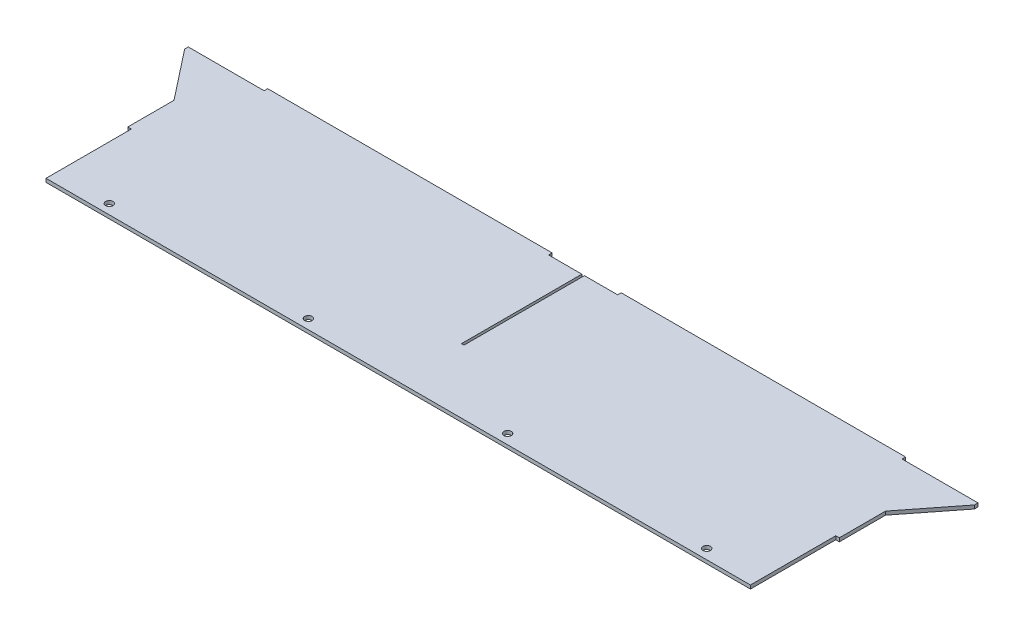
ISO-10303-21;
HEADER;
FILE_DESCRIPTION(('STEP AP214'),'2;1');
FILE_NAME('part.step','',(''),(''),'','','');
FILE_SCHEMA(('AUTOMOTIVE_DESIGN { 1 0 10303 214 1 1 1 1 }'));
ENDSEC;
DATA;
#1=APPLICATION_CONTEXT('core data for automotive mechanical design processes');
#2=APPLICATION_PROTOCOL_DEFINITION('international standard','automotive_design',2000,#1);
#3=PRODUCT_CONTEXT('',#1,'mechanical');
#4=PRODUCT('Part','Part','',(#3));
#5=PRODUCT_RELATED_PRODUCT_CATEGORY('part','',(#4));
#6=PRODUCT_DEFINITION_FORMATION('','',#4);
#7=PRODUCT_DEFINITION_CONTEXT('part definition',#1,'design');
#8=PRODUCT_DEFINITION('design','',#6,#7);
#9=PRODUCT_DEFINITION_SHAPE('','',#8);
#10=(LENGTH_UNIT() NAMED_UNIT(*) SI_UNIT(.MILLI.,.METRE.));
#11=(NAMED_UNIT(*) PLANE_ANGLE_UNIT() SI_UNIT($,.RADIAN.));
#12=(NAMED_UNIT(*) SI_UNIT($,.STERADIAN.) SOLID_ANGLE_UNIT());
#13=UNCERTAINTY_MEASURE_WITH_UNIT(LENGTH_MEASURE(1.E-05),#10,'distance_accuracy_value','');
#14=(GEOMETRIC_REPRESENTATION_CONTEXT(3) GLOBAL_UNCERTAINTY_ASSIGNED_CONTEXT((#13)) GLOBAL_UNIT_ASSIGNED_CONTEXT((#10,
#11,#12)) REPRESENTATION_CONTEXT('',''));
#15=CARTESIAN_POINT('',(0.,0.,0.));
#16=DIRECTION('',(0.,0.,1.));
#17=DIRECTION('',(1.,0.,0.));
#18=AXIS2_PLACEMENT_3D('',#15,#16,#17);
#19=CARTESIAN_POINT('',(-266.7,1.5875,73.8124000000001));
#20=DIRECTION('',(0.,1.,0.));
#21=DIRECTION('',(0.,0.,1.));
#22=AXIS2_PLACEMENT_3D('',#19,#20,#21);
#23=CYLINDRICAL_SURFACE('',#22,3.3);
#24=CARTESIAN_POINT('',(-266.7,-1.58750000000007,73.8124000000001));
#25=DIRECTION('',(0.,1.,0.));
#26=DIRECTION('',(0.,0.,1.));
#27=AXIS2_PLACEMENT_3D('',#24,#25,#26);
#28=CIRCLE('',#27,3.30000000000003);
#29=CARTESIAN_POINT('',(-266.7,-1.58750000000007,77.1124000000001));
#30=VERTEX_POINT('',#29);
#31=EDGE_CURVE('E47',#30,#30,#28,.T.);
#32=ORIENTED_EDGE('',*,*,#31,.F.);
#33=EDGE_LOOP('',(#32));
#34=FACE_BOUND('',#33,.T.);
#35=CARTESIAN_POINT('',(-266.7,1.5875,73.8124000000001));
#36=DIRECTION('',(0.,1.,0.));
#37=DIRECTION('',(0.,0.,1.));
#38=AXIS2_PLACEMENT_3D('',#35,#36,#37);
#39=CIRCLE('',#38,3.29999999999997);
#40=CARTESIAN_POINT('',(-266.7,1.5875,77.1124000000001));
#41=VERTEX_POINT('',#40);
#42=EDGE_CURVE('E11',#41,#41,#39,.T.);
#43=ORIENTED_EDGE('',*,*,#42,.T.);
#44=EDGE_LOOP('',(#43));
#45=FACE_BOUND('',#44,.T.);
#46=ADVANCED_FACE('F39',(#34,#45),#23,.F.);
#47=CARTESIAN_POINT('',(-88.8999999999999,1.5875,73.8124000000001));
#48=DIRECTION('',(0.,1.,0.));
#49=DIRECTION('',(0.,0.,1.));
#50=AXIS2_PLACEMENT_3D('',#47,#48,#49);
#51=CYLINDRICAL_SURFACE('',#50,3.3);
#52=CARTESIAN_POINT('',(-88.8999999999999,-1.58750000000007,73.8124000000001));
#53=DIRECTION('',(0.,1.,0.));
#54=DIRECTION('',(0.,0.,1.));
#55=AXIS2_PLACEMENT_3D('',#52,#53,#54);
#56=CIRCLE('',#55,3.30000000000003);
#57=CARTESIAN_POINT('',(-88.8999999999999,-1.58750000000007,77.1124000000001));
#58=VERTEX_POINT('',#57);
#59=EDGE_CURVE('E230',#58,#58,#56,.T.);
#60=ORIENTED_EDGE('',*,*,#59,.F.);
#61=EDGE_LOOP('',(#60));
#62=FACE_BOUND('',#61,.T.);
#63=CARTESIAN_POINT('',(-88.8999999999999,1.5875,73.8124000000001));
#64=DIRECTION('',(0.,1.,0.));
#65=DIRECTION('',(0.,0.,1.));
#66=AXIS2_PLACEMENT_3D('',#63,#64,#65);
#67=CIRCLE('',#66,3.29999999999997);
#68=CARTESIAN_POINT('',(-88.8999999999999,1.5875,77.1124000000001));
#69=VERTEX_POINT('',#68);
#70=EDGE_CURVE('E236',#69,#69,#67,.T.);
#71=ORIENTED_EDGE('',*,*,#70,.T.);
#72=EDGE_LOOP('',(#71));
#73=FACE_BOUND('',#72,.T.);
#74=ADVANCED_FACE('F270',(#62,#73),#51,.F.);
#75=CARTESIAN_POINT('',(317.6778,1.5875,-82.55));
#76=DIRECTION('',(-1.,0.,0.));
#77=DIRECTION('',(0.,0.,1.));
#78=AXIS2_PLACEMENT_3D('',#75,#76,#77);
#79=PLANE('',#78);
#80=DIRECTION('',(0.,-1.,0.));
#81=VECTOR('',#80,1.);
#82=CARTESIAN_POINT('',(317.6778,1.5875,6.35000000000007));
#83=LINE('',#82,#81);
#84=CARTESIAN_POINT('',(317.6778,1.5875,6.35000000000007));
#85=VERTEX_POINT('',#84);
#86=CARTESIAN_POINT('',(317.6778,-1.5875,6.35000000000007));
#87=VERTEX_POINT('',#86);
#88=EDGE_CURVE('E762',#85,#87,#83,.T.);
#89=ORIENTED_EDGE('',*,*,#88,.T.);
#90=DIRECTION('',(0.,0.,-1.));
#91=VECTOR('',#90,1.);
#92=CARTESIAN_POINT('',(317.6778,-1.5875,-82.55));
#93=LINE('',#92,#91);
#94=CARTESIAN_POINT('',(317.6778,-1.5875,-34.925));
#95=VERTEX_POINT('',#94);
#96=EDGE_CURVE('E242',#87,#95,#93,.T.);
#97=ORIENTED_EDGE('',*,*,#96,.T.);
#98=DIRECTION('',(0.,-1.,0.));
#99=VECTOR('',#98,1.);
#100=CARTESIAN_POINT('',(317.6778,1.5875,-34.925));
#101=LINE('',#100,#99);
#102=CARTESIAN_POINT('',(317.6778,1.5875,-34.925));
#103=VERTEX_POINT('',#102);
#104=EDGE_CURVE('E622',#103,#95,#101,.T.);
#105=ORIENTED_EDGE('',*,*,#104,.F.);
#106=DIRECTION('',(0.,0.,-1.));
#107=VECTOR('',#106,1.);
#108=CARTESIAN_POINT('',(317.6778,1.5875,-82.55));
#109=LINE('',#108,#107);
#110=EDGE_CURVE('E258',#85,#103,#109,.T.);
#111=ORIENTED_EDGE('',*,*,#110,.F.);
#112=EDGE_LOOP('',(#89,#97,#105,#111));
#113=FACE_BOUND('',#112,.T.);
#114=ADVANCED_FACE('F301',(#113),#79,.F.);
#115=CARTESIAN_POINT('',(-317.6778,1.5875,-82.55));
#116=DIRECTION('',(0.,0.,1.));
#117=DIRECTION('',(1.,0.,0.));
#118=AXIS2_PLACEMENT_3D('',#115,#116,#117);
#119=PLANE('',#118);
#120=DIRECTION('',(0.,-1.,0.));
#121=VECTOR('',#120,1.);
#122=CARTESIAN_POINT('',(-1.14299999999998,1.5875,-82.55));
#123=LINE('',#122,#121);
#124=CARTESIAN_POINT('',(-1.14299999999998,1.5875,-82.55));
#125=VERTEX_POINT('',#124);
#126=CARTESIAN_POINT('',(-1.14299999999998,-1.5875,-82.55));
#127=VERTEX_POINT('',#126);
#128=EDGE_CURVE('E549',#125,#127,#123,.T.);
#129=ORIENTED_EDGE('',*,*,#128,.T.);
#130=DIRECTION('',(-1.,0.,0.));
#131=VECTOR('',#130,1.);
#132=CARTESIAN_POINT('',(-317.6778,-1.5875,-82.55));
#133=LINE('',#132,#131);
#134=CARTESIAN_POINT('',(-30.8229000000015,-1.5875,-82.55));
#135=VERTEX_POINT('',#134);
#136=EDGE_CURVE('E252',#127,#135,#133,.T.);
#137=ORIENTED_EDGE('',*,*,#136,.T.);
#138=DIRECTION('',(0.,-1.,0.));
#139=VECTOR('',#138,1.);
#140=CARTESIAN_POINT('',(-30.8229000000015,-1.58750000000007,-82.55));
#141=LINE('',#140,#139);
#142=CARTESIAN_POINT('',(-30.8229000000015,1.5875,-82.55));
#143=VERTEX_POINT('',#142);
#144=EDGE_CURVE('E669',#143,#135,#141,.T.);
#145=ORIENTED_EDGE('',*,*,#144,.F.);
#146=DIRECTION('',(-1.,0.,0.));
#147=VECTOR('',#146,1.);
#148=CARTESIAN_POINT('',(-317.6778,1.5875,-82.55));
#149=LINE('',#148,#147);
#150=EDGE_CURVE('E553',#125,#143,#149,.T.);
#151=ORIENTED_EDGE('',*,*,#150,.F.);
#152=EDGE_LOOP('',(#129,#137,#145,#151));
#153=FACE_BOUND('',#152,.T.);
#154=ADVANCED_FACE('F284',(#153),#119,.F.);
#155=CARTESIAN_POINT('',(-317.6778,1.5875,82.55));
#156=DIRECTION('',(0.,0.,-1.));
#157=DIRECTION('',(-1.,0.,0.));
#158=AXIS2_PLACEMENT_3D('',#155,#156,#157);
#159=PLANE('',#158);
#160=DIRECTION('',(1.,0.,0.));
#161=VECTOR('',#160,1.);
#162=CARTESIAN_POINT('',(-317.6778,-1.5875,82.55));
#163=LINE('',#162,#161);
#164=CARTESIAN_POINT('',(-314.5028,-1.5875,82.55));
#165=VERTEX_POINT('',#164);
#166=CARTESIAN_POINT('',(314.5028,-1.5875,82.55));
#167=VERTEX_POINT('',#166);
#168=EDGE_CURVE('E256',#165,#167,#163,.T.);
#169=ORIENTED_EDGE('',*,*,#168,.T.);
#170=DIRECTION('',(0.,-1.,0.));
#171=VECTOR('',#170,1.);
#172=CARTESIAN_POINT('',(314.5028,1.5875,82.55));
#173=LINE('',#172,#171);
#174=CARTESIAN_POINT('',(314.5028,1.5875,82.55));
#175=VERTEX_POINT('',#174);
#176=EDGE_CURVE('E228',#175,#167,#173,.T.);
#177=ORIENTED_EDGE('',*,*,#176,.F.);
#178=DIRECTION('',(1.,0.,0.));
#179=VECTOR('',#178,1.);
#180=CARTESIAN_POINT('',(-317.6778,1.5875,82.55));
#181=LINE('',#180,#179);
#182=CARTESIAN_POINT('',(-314.5028,1.5875,82.55));
#183=VERTEX_POINT('',#182);
#184=EDGE_CURVE('E221',#183,#175,#181,.T.);
#185=ORIENTED_EDGE('',*,*,#184,.F.);
#186=DIRECTION('',(0.,-1.,0.));
#187=VECTOR('',#186,1.);
#188=CARTESIAN_POINT('',(-314.5028,1.5875,82.55));
#189=LINE('',#188,#187);
#190=EDGE_CURVE('E201',#183,#165,#189,.T.);
#191=ORIENTED_EDGE('',*,*,#190,.T.);
#192=EDGE_LOOP('',(#169,#177,#185,#191));
#193=FACE_BOUND('',#192,.T.);
#194=ADVANCED_FACE('F227',(#193),#159,.F.);
#195=CARTESIAN_POINT('',(0.,1.5875,0.));
#196=DIRECTION('',(0.,1.,0.));
#197=DIRECTION('',(0.,0.,1.));
#198=AXIS2_PLACEMENT_3D('',#195,#196,#197);
#199=PLANE('',#198);
#200=CARTESIAN_POINT('',(88.9000000000001,1.5875,73.8124000000001));
#201=DIRECTION('',(0.,1.,0.));
#202=DIRECTION('',(0.,0.,1.));
#203=AXIS2_PLACEMENT_3D('',#200,#201,#202);
#204=CIRCLE('',#203,3.29999999999997);
#205=CARTESIAN_POINT('',(88.9000000000001,1.5875,77.1124000000001));
#206=VERTEX_POINT('',#205);
#207=EDGE_CURVE('E804',#206,#206,#204,.T.);
#208=ORIENTED_EDGE('',*,*,#207,.F.);
#209=EDGE_LOOP('',(#208));
#210=FACE_BOUND('',#209,.T.);
#211=CARTESIAN_POINT('',(266.7,1.5875,73.8124000000001));
#212=DIRECTION('',(0.,1.,0.));
#213=DIRECTION('',(0.,0.,1.));
#214=AXIS2_PLACEMENT_3D('',#211,#212,#213);
#215=CIRCLE('',#214,3.29999999999997);
#216=CARTESIAN_POINT('',(266.7,1.5875,77.1124000000001));
#217=VERTEX_POINT('',#216);
#218=EDGE_CURVE('E800',#217,#217,#215,.T.);
#219=ORIENTED_EDGE('',*,*,#218,.F.);
#220=EDGE_LOOP('',(#219));
#221=FACE_BOUND('',#220,.T.);
#222=DIRECTION('',(0.,0.,-1.));
#223=VECTOR('',#222,1.);
#224=CARTESIAN_POINT('',(314.5028,1.5875,0.));
#225=LINE('',#224,#223);
#226=CARTESIAN_POINT('',(314.5028,1.5875,6.35000000000006));
#227=VERTEX_POINT('',#226);
#228=EDGE_CURVE('E768',#175,#227,#225,.T.);
#229=ORIENTED_EDGE('',*,*,#228,.T.);
#230=DIRECTION('',(-1.,0.,0.));
#231=VECTOR('',#230,1.);
#232=CARTESIAN_POINT('',(0.,1.5875,6.34999999999998));
#233=LINE('',#232,#231);
#234=EDGE_CURVE('E772',#85,#227,#233,.T.);
#235=ORIENTED_EDGE('',*,*,#234,.F.);
#236=ORIENTED_EDGE('',*,*,#110,.T.);
#237=DIRECTION('',(-0.617821551931904,0.,0.786318338822422));
#238=VECTOR('',#237,1.);
#239=CARTESIAN_POINT('',(352.6028,1.5875,-79.375));
#240=LINE('',#239,#238);
#241=CARTESIAN_POINT('',(352.6028,1.5875,-79.375));
#242=VERTEX_POINT('',#241);
#243=EDGE_CURVE('E610',#242,#103,#240,.T.);
#244=ORIENTED_EDGE('',*,*,#243,.F.);
#245=DIRECTION('',(0.,0.,1.));
#246=VECTOR('',#245,1.);
#247=CARTESIAN_POINT('',(352.6028,1.5875,-82.55));
#248=LINE('',#247,#246);
#249=CARTESIAN_POINT('',(352.6028,1.5875,-82.55));
#250=VERTEX_POINT('',#249);
#251=EDGE_CURVE('E606',#250,#242,#248,.T.);
#252=ORIENTED_EDGE('',*,*,#251,.F.);
#253=CARTESIAN_POINT('',(284.822900000001,1.5875,-82.55));
#254=VERTEX_POINT('',#253);
#255=EDGE_CURVE('E238',#250,#254,#149,.T.);
#256=ORIENTED_EDGE('',*,*,#255,.T.);
#257=DIRECTION('',(0.,0.,1.));
#258=VECTOR('',#257,1.);
#259=CARTESIAN_POINT('',(284.822900000001,1.58749999999994,-85.725));
#260=LINE('',#259,#258);
#261=CARTESIAN_POINT('',(284.822900000001,1.58749999999994,-85.725));
#262=VERTEX_POINT('',#261);
#263=EDGE_CURVE('E647',#262,#254,#260,.T.);
#264=ORIENTED_EDGE('',*,*,#263,.F.);
#265=DIRECTION('',(1.,0.,0.));
#266=VECTOR('',#265,1.);
#267=CARTESIAN_POINT('',(284.822900000001,1.58749999999994,-85.725));
#268=LINE('',#267,#266);
#269=CARTESIAN_POINT('',(30.8229000000015,1.58749999999994,-85.725));
#270=VERTEX_POINT('',#269);
#271=EDGE_CURVE('E644',#270,#262,#268,.T.);
#272=ORIENTED_EDGE('',*,*,#271,.F.);
#273=DIRECTION('',(0.,0.,1.));
#274=VECTOR('',#273,1.);
#275=CARTESIAN_POINT('',(30.8229000000015,1.58749999999994,-85.725));
#276=LINE('',#275,#274);
#277=CARTESIAN_POINT('',(30.8229000000014,1.5875,-82.55));
#278=VERTEX_POINT('',#277);
#279=EDGE_CURVE('E657',#270,#278,#276,.T.);
#280=ORIENTED_EDGE('',*,*,#279,.T.);
#281=CARTESIAN_POINT('',(1.14300000000002,1.5875,-82.55));
#282=VERTEX_POINT('',#281);
#283=EDGE_CURVE('E704',#278,#282,#149,.T.);
#284=ORIENTED_EDGE('',*,*,#283,.T.);
#285=DIRECTION('',(0.,0.,1.));
#286=VECTOR('',#285,1.);
#287=CARTESIAN_POINT('',(1.14300000000002,1.5875,0.));
#288=LINE('',#287,#286);
#289=CARTESIAN_POINT('',(1.14300000000002,1.5875,24.892));
#290=VERTEX_POINT('',#289);
#291=EDGE_CURVE('E721',#282,#290,#288,.T.);
#292=ORIENTED_EDGE('',*,*,#291,.T.);
#293=DIRECTION('',(1.,0.,0.));
#294=VECTOR('',#293,1.);
#295=CARTESIAN_POINT('',(0.,1.5875,24.892));
#296=LINE('',#295,#294);
#297=CARTESIAN_POINT('',(-1.14299999999998,1.5875,24.892));
#298=VERTEX_POINT('',#297);
#299=EDGE_CURVE('E719',#298,#290,#296,.T.);
#300=ORIENTED_EDGE('',*,*,#299,.F.);
#301=DIRECTION('',(0.,0.,1.));
#302=VECTOR('',#301,1.);
#303=CARTESIAN_POINT('',(-1.14299999999998,1.5875,0.));
#304=LINE('',#303,#302);
#305=EDGE_CURVE('E717',#125,#298,#304,.T.);
#306=ORIENTED_EDGE('',*,*,#305,.F.);
#307=ORIENTED_EDGE('',*,*,#150,.T.);
#308=DIRECTION('',(0.,0.,1.));
#309=VECTOR('',#308,1.);
#310=CARTESIAN_POINT('',(-30.8229000000015,1.58749999999994,-85.725));
#311=LINE('',#310,#309);
#312=CARTESIAN_POINT('',(-30.8229000000015,1.58749999999994,-85.725));
#313=VERTEX_POINT('',#312);
#314=EDGE_CURVE('E683',#313,#143,#311,.T.);
#315=ORIENTED_EDGE('',*,*,#314,.F.);
#316=DIRECTION('',(1.,0.,0.));
#317=VECTOR('',#316,1.);
#318=CARTESIAN_POINT('',(-30.8229000000015,1.58749999999994,-85.725));
#319=LINE('',#318,#317);
#320=CARTESIAN_POINT('',(-284.822900000001,1.58749999999994,-85.725));
#321=VERTEX_POINT('',#320);
#322=EDGE_CURVE('E680',#321,#313,#319,.T.);
#323=ORIENTED_EDGE('',*,*,#322,.F.);
#324=DIRECTION('',(0.,0.,1.));
#325=VECTOR('',#324,1.);
#326=CARTESIAN_POINT('',(-284.822900000001,1.58749999999994,-85.725));
#327=LINE('',#326,#325);
#328=CARTESIAN_POINT('',(-284.822900000001,1.58749999999994,-82.55));
#329=VERTEX_POINT('',#328);
#330=EDGE_CURVE('E691',#321,#329,#327,.T.);
#331=ORIENTED_EDGE('',*,*,#330,.T.);
#332=CARTESIAN_POINT('',(-352.6028,1.5875,-82.55));
#333=VERTEX_POINT('',#332);
#334=EDGE_CURVE('E701',#329,#333,#149,.T.);
#335=ORIENTED_EDGE('',*,*,#334,.T.);
#336=DIRECTION('',(0.,0.,1.));
#337=VECTOR('',#336,1.);
#338=CARTESIAN_POINT('',(-352.6028,1.5875,-82.55));
#339=LINE('',#338,#337);
#340=CARTESIAN_POINT('',(-352.6028,1.5875,-79.375));
#341=VERTEX_POINT('',#340);
#342=EDGE_CURVE('E582',#333,#341,#339,.T.);
#343=ORIENTED_EDGE('',*,*,#342,.T.);
#344=DIRECTION('',(0.617821551931904,0.,0.786318338822422));
#345=VECTOR('',#344,1.);
#346=CARTESIAN_POINT('',(-352.6028,1.5875,-79.375));
#347=LINE('',#346,#345);
#348=CARTESIAN_POINT('',(-317.6778,1.5875,-34.925));
#349=VERTEX_POINT('',#348);
#350=EDGE_CURVE('E591',#341,#349,#347,.T.);
#351=ORIENTED_EDGE('',*,*,#350,.T.);
#352=DIRECTION('',(0.,0.,1.));
#353=VECTOR('',#352,1.);
#354=CARTESIAN_POINT('',(-317.6778,1.5875,-82.55));
#355=LINE('',#354,#353);
#356=CARTESIAN_POINT('',(-317.6778,1.5875,6.34999999999999));
#357=VERTEX_POINT('',#356);
#358=EDGE_CURVE('E231',#349,#357,#355,.T.);
#359=ORIENTED_EDGE('',*,*,#358,.T.);
#360=DIRECTION('',(1.,0.,0.));
#361=VECTOR('',#360,1.);
#362=CARTESIAN_POINT('',(0.,1.5875,6.34999999999999));
#363=LINE('',#362,#361);
#364=CARTESIAN_POINT('',(-314.5028,1.5875,6.34999999999999));
#365=VERTEX_POINT('',#364);
#366=EDGE_CURVE('E213',#357,#365,#363,.T.);
#367=ORIENTED_EDGE('',*,*,#366,.T.);
#368=DIRECTION('',(0.,0.,-1.));
#369=VECTOR('',#368,1.);
#370=CARTESIAN_POINT('',(-314.5028,1.5875,0.));
#371=LINE('',#370,#369);
#372=EDGE_CURVE('E204',#183,#365,#371,.T.);
#373=ORIENTED_EDGE('',*,*,#372,.F.);
#374=ORIENTED_EDGE('',*,*,#184,.T.);
#375=EDGE_LOOP('',(#229,#235,#236,#244,#252,#256,#264,#272,#280,#284,#292,#300,#306,#307,#315,
#323,#331,#335,#343,#351,#359,#367,#373,#374));
#376=FACE_BOUND('',#375,.T.);
#377=ORIENTED_EDGE('',*,*,#70,.F.);
#378=EDGE_LOOP('',(#377));
#379=FACE_BOUND('',#378,.T.);
#380=ORIENTED_EDGE('',*,*,#42,.F.);
#381=EDGE_LOOP('',(#380));
#382=FACE_BOUND('',#381,.T.);
#383=ADVANCED_FACE('F219',(#210,#221,#376,#379,#382),#199,.T.);
#384=CARTESIAN_POINT('',(0.,-1.5875,0.));
#385=DIRECTION('',(0.,1.,0.));
#386=DIRECTION('',(0.,0.,1.));
#387=AXIS2_PLACEMENT_3D('',#384,#385,#386);
#388=PLANE('',#387);
#389=CARTESIAN_POINT('',(88.9000000000001,-1.58750000000007,73.8124000000001));
#390=DIRECTION('',(0.,1.,0.));
#391=DIRECTION('',(0.,0.,1.));
#392=AXIS2_PLACEMENT_3D('',#389,#390,#391);
#393=CIRCLE('',#392,3.30000000000003);
#394=CARTESIAN_POINT('',(88.9000000000001,-1.58750000000007,77.1124000000001));
#395=VERTEX_POINT('',#394);
#396=EDGE_CURVE('E808',#395,#395,#393,.T.);
#397=ORIENTED_EDGE('',*,*,#396,.T.);
#398=EDGE_LOOP('',(#397));
#399=FACE_BOUND('',#398,.T.);
#400=CARTESIAN_POINT('',(266.7,-1.58750000000007,73.8124000000001));
#401=DIRECTION('',(0.,1.,0.));
#402=DIRECTION('',(0.,0.,1.));
#403=AXIS2_PLACEMENT_3D('',#400,#401,#402);
#404=CIRCLE('',#403,3.30000000000003);
#405=CARTESIAN_POINT('',(266.7,-1.58750000000007,77.1124000000001));
#406=VERTEX_POINT('',#405);
#407=EDGE_CURVE('E774',#406,#406,#404,.T.);
#408=ORIENTED_EDGE('',*,*,#407,.T.);
#409=EDGE_LOOP('',(#408));
#410=FACE_BOUND('',#409,.T.);
#411=DIRECTION('',(-1.,0.,0.));
#412=VECTOR('',#411,1.);
#413=CARTESIAN_POINT('',(0.,-1.5875,6.34999999999998));
#414=LINE('',#413,#412);
#415=CARTESIAN_POINT('',(314.5028,-1.5875,6.35000000000006));
#416=VERTEX_POINT('',#415);
#417=EDGE_CURVE('E764',#87,#416,#414,.T.);
#418=ORIENTED_EDGE('',*,*,#417,.T.);
#419=DIRECTION('',(0.,0.,-1.));
#420=VECTOR('',#419,1.);
#421=CARTESIAN_POINT('',(314.5028,-1.5875,0.));
#422=LINE('',#421,#420);
#423=EDGE_CURVE('E766',#167,#416,#422,.T.);
#424=ORIENTED_EDGE('',*,*,#423,.F.);
#425=ORIENTED_EDGE('',*,*,#168,.F.);
#426=DIRECTION('',(0.,0.,-1.));
#427=VECTOR('',#426,1.);
#428=CARTESIAN_POINT('',(-314.5028,-1.5875,0.));
#429=LINE('',#428,#427);
#430=CARTESIAN_POINT('',(-314.5028,-1.5875,6.34999999999999));
#431=VERTEX_POINT('',#430);
#432=EDGE_CURVE('E207',#165,#431,#429,.T.);
#433=ORIENTED_EDGE('',*,*,#432,.T.);
#434=DIRECTION('',(1.,0.,0.));
#435=VECTOR('',#434,1.);
#436=CARTESIAN_POINT('',(0.,-1.5875,6.34999999999999));
#437=LINE('',#436,#435);
#438=CARTESIAN_POINT('',(-317.6778,-1.5875,6.34999999999998));
#439=VERTEX_POINT('',#438);
#440=EDGE_CURVE('E224',#439,#431,#437,.T.);
#441=ORIENTED_EDGE('',*,*,#440,.F.);
#442=DIRECTION('',(0.,0.,1.));
#443=VECTOR('',#442,1.);
#444=CARTESIAN_POINT('',(-317.6778,-1.5875,-82.55));
#445=LINE('',#444,#443);
#446=CARTESIAN_POINT('',(-317.6778,-1.5875,-34.925));
#447=VERTEX_POINT('',#446);
#448=EDGE_CURVE('E250',#447,#439,#445,.T.);
#449=ORIENTED_EDGE('',*,*,#448,.F.);
#450=DIRECTION('',(0.617821551931904,0.,0.786318338822422));
#451=VECTOR('',#450,1.);
#452=CARTESIAN_POINT('',(-352.6028,-1.5875,-79.375));
#453=LINE('',#452,#451);
#454=CARTESIAN_POINT('',(-352.6028,-1.5875,-79.375));
#455=VERTEX_POINT('',#454);
#456=EDGE_CURVE('E589',#455,#447,#453,.T.);
#457=ORIENTED_EDGE('',*,*,#456,.F.);
#458=DIRECTION('',(0.,0.,1.));
#459=VECTOR('',#458,1.);
#460=CARTESIAN_POINT('',(-352.6028,-1.5875,-82.55));
#461=LINE('',#460,#459);
#462=CARTESIAN_POINT('',(-352.6028,-1.5875,-82.55));
#463=VERTEX_POINT('',#462);
#464=EDGE_CURVE('E580',#463,#455,#461,.T.);
#465=ORIENTED_EDGE('',*,*,#464,.F.);
#466=CARTESIAN_POINT('',(-284.822900000001,-1.5875,-82.55));
#467=VERTEX_POINT('',#466);
#468=EDGE_CURVE('E245',#467,#463,#133,.T.);
#469=ORIENTED_EDGE('',*,*,#468,.F.);
#470=DIRECTION('',(0.,0.,1.));
#471=VECTOR('',#470,1.);
#472=CARTESIAN_POINT('',(-284.822900000001,-1.58750000000007,-85.725));
#473=LINE('',#472,#471);
#474=CARTESIAN_POINT('',(-284.822900000001,-1.58750000000007,-85.725));
#475=VERTEX_POINT('',#474);
#476=EDGE_CURVE('E695',#475,#467,#473,.T.);
#477=ORIENTED_EDGE('',*,*,#476,.F.);
#478=DIRECTION('',(-1.,0.,0.));
#479=VECTOR('',#478,1.);
#480=CARTESIAN_POINT('',(-30.8229000000015,-1.58750000000007,-85.725));
#481=LINE('',#480,#479);
#482=CARTESIAN_POINT('',(-30.8229000000015,-1.58750000000007,-85.725));
#483=VERTEX_POINT('',#482);
#484=EDGE_CURVE('E674',#483,#475,#481,.T.);
#485=ORIENTED_EDGE('',*,*,#484,.F.);
#486=DIRECTION('',(0.,0.,1.));
#487=VECTOR('',#486,1.);
#488=CARTESIAN_POINT('',(-30.8229000000015,-1.58750000000007,-85.725));
#489=LINE('',#488,#487);
#490=EDGE_CURVE('E246',#483,#135,#489,.T.);
#491=ORIENTED_EDGE('',*,*,#490,.T.);
#492=ORIENTED_EDGE('',*,*,#136,.F.);
#493=DIRECTION('',(0.,0.,1.));
#494=VECTOR('',#493,1.);
#495=CARTESIAN_POINT('',(-1.14299999999998,-1.5875,0.));
#496=LINE('',#495,#494);
#497=CARTESIAN_POINT('',(-1.14299999999998,-1.5875,24.892));
#498=VERTEX_POINT('',#497);
#499=EDGE_CURVE('E562',#127,#498,#496,.T.);
#500=ORIENTED_EDGE('',*,*,#499,.T.);
#501=DIRECTION('',(1.,0.,0.));
#502=VECTOR('',#501,1.);
#503=CARTESIAN_POINT('',(0.,-1.5875,24.892));
#504=LINE('',#503,#502);
#505=CARTESIAN_POINT('',(1.14300000000002,-1.5875,24.892));
#506=VERTEX_POINT('',#505);
#507=EDGE_CURVE('E54',#498,#506,#504,.T.);
#508=ORIENTED_EDGE('',*,*,#507,.T.);
#509=DIRECTION('',(0.,0.,1.));
#510=VECTOR('',#509,1.);
#511=CARTESIAN_POINT('',(1.14300000000002,-1.5875,0.));
#512=LINE('',#511,#510);
#513=CARTESIAN_POINT('',(1.14300000000002,-1.5875,-82.55));
#514=VERTEX_POINT('',#513);
#515=EDGE_CURVE('E726',#514,#506,#512,.T.);
#516=ORIENTED_EDGE('',*,*,#515,.F.);
#517=CARTESIAN_POINT('',(30.8229000000015,-1.58750000000007,-82.55));
#518=VERTEX_POINT('',#517);
#519=EDGE_CURVE('E251',#518,#514,#133,.T.);
#520=ORIENTED_EDGE('',*,*,#519,.F.);
#521=DIRECTION('',(0.,0.,1.));
#522=VECTOR('',#521,1.);
#523=CARTESIAN_POINT('',(30.8229000000015,-1.58750000000007,-85.725));
#524=LINE('',#523,#522);
#525=CARTESIAN_POINT('',(30.8229000000015,-1.58750000000007,-85.725));
#526=VERTEX_POINT('',#525);
#527=EDGE_CURVE('E661',#526,#518,#524,.T.);
#528=ORIENTED_EDGE('',*,*,#527,.F.);
#529=DIRECTION('',(-1.,0.,0.));
#530=VECTOR('',#529,1.);
#531=CARTESIAN_POINT('',(284.822900000001,-1.58750000000007,-85.725));
#532=LINE('',#531,#530);
#533=CARTESIAN_POINT('',(284.822900000001,-1.58750000000007,-85.725));
#534=VERTEX_POINT('',#533);
#535=EDGE_CURVE('E637',#534,#526,#532,.T.);
#536=ORIENTED_EDGE('',*,*,#535,.F.);
#537=DIRECTION('',(0.,0.,1.));
#538=VECTOR('',#537,1.);
#539=CARTESIAN_POINT('',(284.822900000001,-1.58750000000007,-85.725));
#540=LINE('',#539,#538);
#541=CARTESIAN_POINT('',(284.822900000001,-1.5875,-82.55));
#542=VERTEX_POINT('',#541);
#543=EDGE_CURVE('E665',#534,#542,#540,.T.);
#544=ORIENTED_EDGE('',*,*,#543,.T.);
#545=CARTESIAN_POINT('',(352.6028,-1.5875,-82.55));
#546=VERTEX_POINT('',#545);
#547=EDGE_CURVE('E247',#546,#542,#133,.T.);
#548=ORIENTED_EDGE('',*,*,#547,.F.);
#549=DIRECTION('',(0.,0.,1.));
#550=VECTOR('',#549,1.);
#551=CARTESIAN_POINT('',(352.6028,-1.5875,-82.55));
#552=LINE('',#551,#550);
#553=CARTESIAN_POINT('',(352.6028,-1.5875,-79.375));
#554=VERTEX_POINT('',#553);
#555=EDGE_CURVE('E584',#546,#554,#552,.T.);
#556=ORIENTED_EDGE('',*,*,#555,.T.);
#557=DIRECTION('',(-0.617821551931904,0.,0.786318338822422));
#558=VECTOR('',#557,1.);
#559=CARTESIAN_POINT('',(352.6028,-1.5875,-79.375));
#560=LINE('',#559,#558);
#561=EDGE_CURVE('E611',#554,#95,#560,.T.);
#562=ORIENTED_EDGE('',*,*,#561,.T.);
#563=ORIENTED_EDGE('',*,*,#96,.F.);
#564=EDGE_LOOP('',(#418,#424,#425,#433,#441,#449,#457,#465,#469,#477,#485,#491,#492,#500,#508,
#516,#520,#528,#536,#544,#548,#556,#562,#563));
#565=FACE_BOUND('',#564,.T.);
#566=ORIENTED_EDGE('',*,*,#59,.T.);
#567=EDGE_LOOP('',(#566));
#568=FACE_BOUND('',#567,.T.);
#569=ORIENTED_EDGE('',*,*,#31,.T.);
#570=EDGE_LOOP('',(#569));
#571=FACE_BOUND('',#570,.T.);
#572=ADVANCED_FACE('F266',(#399,#410,#565,#568,#571),#388,.F.);
#573=DIRECTION('',(0.,-1.,0.));
#574=VECTOR('',#573,1.);
#575=CARTESIAN_POINT('',(284.822900000001,-1.58750000000007,-82.55));
#576=LINE('',#575,#574);
#577=EDGE_CURVE('E626',#254,#542,#576,.T.);
#578=ORIENTED_EDGE('',*,*,#577,.F.);
#579=ORIENTED_EDGE('',*,*,#255,.F.);
#580=DIRECTION('',(0.,-1.,0.));
#581=VECTOR('',#580,1.);
#582=CARTESIAN_POINT('',(352.6028,1.5875,-82.55));
#583=LINE('',#582,#581);
#584=EDGE_CURVE('E615',#250,#546,#583,.T.);
#585=ORIENTED_EDGE('',*,*,#584,.T.);
#586=ORIENTED_EDGE('',*,*,#547,.T.);
#587=EDGE_LOOP('',(#578,#579,#585,#586));
#588=FACE_BOUND('',#587,.T.);
#589=ADVANCED_FACE('F280',(#588),#119,.F.);
#590=ORIENTED_EDGE('',*,*,#519,.T.);
#591=DIRECTION('',(0.,-1.,0.));
#592=VECTOR('',#591,1.);
#593=CARTESIAN_POINT('',(1.14300000000002,1.5875,-82.55));
#594=LINE('',#593,#592);
#595=EDGE_CURVE('E556',#282,#514,#594,.T.);
#596=ORIENTED_EDGE('',*,*,#595,.F.);
#597=ORIENTED_EDGE('',*,*,#283,.F.);
#598=DIRECTION('',(0.,1.,0.));
#599=VECTOR('',#598,1.);
#600=CARTESIAN_POINT('',(30.8229000000015,1.58749999999994,-82.55));
#601=LINE('',#600,#599);
#602=EDGE_CURVE('E638',#518,#278,#601,.T.);
#603=ORIENTED_EDGE('',*,*,#602,.F.);
#604=EDGE_LOOP('',(#590,#596,#597,#603));
#605=FACE_BOUND('',#604,.T.);
#606=ADVANCED_FACE('F299',(#605),#119,.F.);
#607=DIRECTION('',(0.,1.,0.));
#608=VECTOR('',#607,1.);
#609=CARTESIAN_POINT('',(-284.822900000001,1.58749999999994,-82.55));
#610=LINE('',#609,#608);
#611=EDGE_CURVE('E575',#467,#329,#610,.T.);
#612=ORIENTED_EDGE('',*,*,#611,.F.);
#613=ORIENTED_EDGE('',*,*,#468,.T.);
#614=DIRECTION('',(0.,-1.,0.));
#615=VECTOR('',#614,1.);
#616=CARTESIAN_POINT('',(-352.6028,1.5875,-82.55));
#617=LINE('',#616,#615);
#618=EDGE_CURVE('E572',#333,#463,#617,.T.);
#619=ORIENTED_EDGE('',*,*,#618,.F.);
#620=ORIENTED_EDGE('',*,*,#334,.F.);
#621=EDGE_LOOP('',(#612,#613,#619,#620));
#622=FACE_BOUND('',#621,.T.);
#623=ADVANCED_FACE('F295',(#622),#119,.F.);
#624=CARTESIAN_POINT('',(-317.6778,1.5875,-82.55));
#625=DIRECTION('',(1.,0.,0.));
#626=DIRECTION('',(0.,0.,-1.));
#627=AXIS2_PLACEMENT_3D('',#624,#625,#626);
#628=PLANE('',#627);
#629=ORIENTED_EDGE('',*,*,#448,.T.);
#630=DIRECTION('',(0.,-1.,0.));
#631=VECTOR('',#630,1.);
#632=CARTESIAN_POINT('',(-317.6778,1.5875,6.34999999999999));
#633=LINE('',#632,#631);
#634=EDGE_CURVE('E62',#357,#439,#633,.T.);
#635=ORIENTED_EDGE('',*,*,#634,.F.);
#636=ORIENTED_EDGE('',*,*,#358,.F.);
#637=DIRECTION('',(0.,-1.,0.));
#638=VECTOR('',#637,1.);
#639=CARTESIAN_POINT('',(-317.6778,1.5875,-34.925));
#640=LINE('',#639,#638);
#641=EDGE_CURVE('E602',#349,#447,#640,.T.);
#642=ORIENTED_EDGE('',*,*,#641,.T.);
#643=EDGE_LOOP('',(#629,#635,#636,#642));
#644=FACE_BOUND('',#643,.T.);
#645=ADVANCED_FACE('F292',(#644),#628,.F.);
#646=CARTESIAN_POINT('',(-30.8229000000015,-1.58750000000007,-85.725));
#647=DIRECTION('',(-1.,0.,0.));
#648=DIRECTION('',(0.,0.,1.));
#649=AXIS2_PLACEMENT_3D('',#646,#647,#648);
#650=PLANE('',#649);
#651=ORIENTED_EDGE('',*,*,#144,.T.);
#652=ORIENTED_EDGE('',*,*,#490,.F.);
#653=DIRECTION('',(0.,-1.,0.));
#654=VECTOR('',#653,1.);
#655=CARTESIAN_POINT('',(-30.8229000000015,-1.58750000000007,-85.725));
#656=LINE('',#655,#654);
#657=EDGE_CURVE('E670',#313,#483,#656,.T.);
#658=ORIENTED_EDGE('',*,*,#657,.F.);
#659=ORIENTED_EDGE('',*,*,#314,.T.);
#660=EDGE_LOOP('',(#651,#652,#658,#659));
#661=FACE_BOUND('',#660,.T.);
#662=ADVANCED_FACE('F289',(#661),#650,.F.);
#663=CARTESIAN_POINT('',(-284.822900000001,1.58749999999994,-85.725));
#664=DIRECTION('',(1.,0.,0.));
#665=DIRECTION('',(0.,1.,0.));
#666=AXIS2_PLACEMENT_3D('',#663,#664,#665);
#667=PLANE('',#666);
#668=ORIENTED_EDGE('',*,*,#611,.T.);
#669=ORIENTED_EDGE('',*,*,#330,.F.);
#670=DIRECTION('',(0.,1.,0.));
#671=VECTOR('',#670,1.);
#672=CARTESIAN_POINT('',(-284.822900000001,1.58749999999994,-85.725));
#673=LINE('',#672,#671);
#674=EDGE_CURVE('E677',#475,#321,#673,.T.);
#675=ORIENTED_EDGE('',*,*,#674,.F.);
#676=ORIENTED_EDGE('',*,*,#476,.T.);
#677=EDGE_LOOP('',(#668,#669,#675,#676));
#678=FACE_BOUND('',#677,.T.);
#679=ADVANCED_FACE('F376',(#678),#667,.F.);
#680=CARTESIAN_POINT('',(0.,0.,-85.725));
#681=DIRECTION('',(0.,0.,1.));
#682=DIRECTION('',(1.,0.,0.));
#683=AXIS2_PLACEMENT_3D('',#680,#681,#682);
#684=PLANE('',#683);
#685=ORIENTED_EDGE('',*,*,#657,.T.);
#686=ORIENTED_EDGE('',*,*,#484,.T.);
#687=ORIENTED_EDGE('',*,*,#674,.T.);
#688=ORIENTED_EDGE('',*,*,#322,.T.);
#689=EDGE_LOOP('',(#685,#686,#687,#688));
#690=FACE_BOUND('',#689,.T.);
#691=ADVANCED_FACE('F383',(#690),#684,.F.);
#692=CARTESIAN_POINT('',(284.822900000001,-1.58750000000007,-85.725));
#693=DIRECTION('',(-1.,0.,0.));
#694=DIRECTION('',(0.,-1.,0.));
#695=AXIS2_PLACEMENT_3D('',#692,#693,#694);
#696=PLANE('',#695);
#697=ORIENTED_EDGE('',*,*,#577,.T.);
#698=ORIENTED_EDGE('',*,*,#543,.F.);
#699=DIRECTION('',(0.,-1.,0.));
#700=VECTOR('',#699,1.);
#701=CARTESIAN_POINT('',(284.822900000001,-1.58750000000007,-85.725));
#702=LINE('',#701,#700);
#703=EDGE_CURVE('E633',#262,#534,#702,.T.);
#704=ORIENTED_EDGE('',*,*,#703,.F.);
#705=ORIENTED_EDGE('',*,*,#263,.T.);
#706=EDGE_LOOP('',(#697,#698,#704,#705));
#707=FACE_BOUND('',#706,.T.);
#708=ADVANCED_FACE('F390',(#707),#696,.F.);
#709=CARTESIAN_POINT('',(30.8229000000015,1.58749999999994,-85.725));
#710=DIRECTION('',(1.,0.,0.));
#711=DIRECTION('',(0.,0.,-1.));
#712=AXIS2_PLACEMENT_3D('',#709,#710,#711);
#713=PLANE('',#712);
#714=ORIENTED_EDGE('',*,*,#602,.T.);
#715=ORIENTED_EDGE('',*,*,#279,.F.);
#716=DIRECTION('',(0.,1.,0.));
#717=VECTOR('',#716,1.);
#718=CARTESIAN_POINT('',(30.8229000000015,1.58749999999994,-85.725));
#719=LINE('',#718,#717);
#720=EDGE_CURVE('E641',#526,#270,#719,.T.);
#721=ORIENTED_EDGE('',*,*,#720,.F.);
#722=ORIENTED_EDGE('',*,*,#527,.T.);
#723=EDGE_LOOP('',(#714,#715,#721,#722));
#724=FACE_BOUND('',#723,.T.);
#725=ADVANCED_FACE('F398',(#724),#713,.F.);
#726=CARTESIAN_POINT('',(0.,0.,-85.725));
#727=DIRECTION('',(0.,0.,1.));
#728=DIRECTION('',(1.,0.,0.));
#729=AXIS2_PLACEMENT_3D('',#726,#727,#728);
#730=PLANE('',#729);
#731=ORIENTED_EDGE('',*,*,#703,.T.);
#732=ORIENTED_EDGE('',*,*,#535,.T.);
#733=ORIENTED_EDGE('',*,*,#720,.T.);
#734=ORIENTED_EDGE('',*,*,#271,.T.);
#735=EDGE_LOOP('',(#731,#732,#733,#734));
#736=FACE_BOUND('',#735,.T.);
#737=ADVANCED_FACE('F406',(#736),#730,.F.);
#738=CARTESIAN_POINT('',(352.6028,1.5875,-79.375));
#739=DIRECTION('',(0.786318338822422,0.,0.617821551931904));
#740=DIRECTION('',(0.617821551931904,0.,-0.786318338822422));
#741=AXIS2_PLACEMENT_3D('',#738,#739,#740);
#742=PLANE('',#741);
#743=ORIENTED_EDGE('',*,*,#561,.F.);
#744=DIRECTION('',(0.,-1.,0.));
#745=VECTOR('',#744,1.);
#746=CARTESIAN_POINT('',(352.6028,1.5875,-79.375));
#747=LINE('',#746,#745);
#748=EDGE_CURVE('E627',#242,#554,#747,.T.);
#749=ORIENTED_EDGE('',*,*,#748,.F.);
#750=ORIENTED_EDGE('',*,*,#243,.T.);
#751=ORIENTED_EDGE('',*,*,#104,.T.);
#752=EDGE_LOOP('',(#743,#749,#750,#751));
#753=FACE_BOUND('',#752,.T.);
#754=ADVANCED_FACE('F413',(#753),#742,.T.);
#755=CARTESIAN_POINT('',(352.6028,1.5875,-82.55));
#756=DIRECTION('',(1.,0.,0.));
#757=DIRECTION('',(0.,0.,-1.));
#758=AXIS2_PLACEMENT_3D('',#755,#756,#757);
#759=PLANE('',#758);
#760=ORIENTED_EDGE('',*,*,#555,.F.);
#761=ORIENTED_EDGE('',*,*,#584,.F.);
#762=ORIENTED_EDGE('',*,*,#251,.T.);
#763=ORIENTED_EDGE('',*,*,#748,.T.);
#764=EDGE_LOOP('',(#760,#761,#762,#763));
#765=FACE_BOUND('',#764,.T.);
#766=ADVANCED_FACE('F420',(#765),#759,.T.);
#767=CARTESIAN_POINT('',(-352.6028,1.5875,-82.55));
#768=DIRECTION('',(1.,0.,0.));
#769=DIRECTION('',(0.,0.,-1.));
#770=AXIS2_PLACEMENT_3D('',#767,#768,#769);
#771=PLANE('',#770);
#772=ORIENTED_EDGE('',*,*,#464,.T.);
#773=DIRECTION('',(0.,-1.,0.));
#774=VECTOR('',#773,1.);
#775=CARTESIAN_POINT('',(-352.6028,1.5875,-79.375));
#776=LINE('',#775,#774);
#777=EDGE_CURVE('E585',#341,#455,#776,.T.);
#778=ORIENTED_EDGE('',*,*,#777,.F.);
#779=ORIENTED_EDGE('',*,*,#342,.F.);
#780=ORIENTED_EDGE('',*,*,#618,.T.);
#781=EDGE_LOOP('',(#772,#778,#779,#780));
#782=FACE_BOUND('',#781,.T.);
#783=ADVANCED_FACE('F427',(#782),#771,.F.);
#784=CARTESIAN_POINT('',(-352.6028,1.5875,-79.375));
#785=DIRECTION('',(0.786318338822422,0.,-0.617821551931904));
#786=DIRECTION('',(-0.617821551931904,0.,-0.786318338822422));
#787=AXIS2_PLACEMENT_3D('',#784,#785,#786);
#788=PLANE('',#787);
#789=ORIENTED_EDGE('',*,*,#456,.T.);
#790=ORIENTED_EDGE('',*,*,#641,.F.);
#791=ORIENTED_EDGE('',*,*,#350,.F.);
#792=ORIENTED_EDGE('',*,*,#777,.T.);
#793=EDGE_LOOP('',(#789,#790,#791,#792));
#794=FACE_BOUND('',#793,.T.);
#795=ADVANCED_FACE('F434',(#794),#788,.F.);
#796=CARTESIAN_POINT('',(0.,1.5875,24.892));
#797=DIRECTION('',(0.,0.,-1.));
#798=DIRECTION('',(-1.,0.,0.));
#799=AXIS2_PLACEMENT_3D('',#796,#797,#798);
#800=PLANE('',#799);
#801=ORIENTED_EDGE('',*,*,#507,.F.);
#802=DIRECTION('',(0.,-1.,0.));
#803=VECTOR('',#802,1.);
#804=CARTESIAN_POINT('',(-1.14299999999998,1.5875,24.892));
#805=LINE('',#804,#803);
#806=EDGE_CURVE('E557',#298,#498,#805,.T.);
#807=ORIENTED_EDGE('',*,*,#806,.F.);
#808=ORIENTED_EDGE('',*,*,#299,.T.);
#809=DIRECTION('',(0.,-1.,0.));
#810=VECTOR('',#809,1.);
#811=CARTESIAN_POINT('',(1.14300000000002,1.5875,24.892));
#812=LINE('',#811,#810);
#813=EDGE_CURVE('E596',#290,#506,#812,.T.);
#814=ORIENTED_EDGE('',*,*,#813,.T.);
#815=EDGE_LOOP('',(#801,#807,#808,#814));
#816=FACE_BOUND('',#815,.T.);
#817=ADVANCED_FACE('F442',(#816),#800,.T.);
#818=CARTESIAN_POINT('',(1.14300000000002,1.5875,0.));
#819=DIRECTION('',(1.,0.,0.));
#820=DIRECTION('',(0.,0.,-1.));
#821=AXIS2_PLACEMENT_3D('',#818,#819,#820);
#822=PLANE('',#821);
#823=ORIENTED_EDGE('',*,*,#515,.T.);
#824=ORIENTED_EDGE('',*,*,#813,.F.);
#825=ORIENTED_EDGE('',*,*,#291,.F.);
#826=ORIENTED_EDGE('',*,*,#595,.T.);
#827=EDGE_LOOP('',(#823,#824,#825,#826));
#828=FACE_BOUND('',#827,.T.);
#829=ADVANCED_FACE('F450',(#828),#822,.F.);
#830=CARTESIAN_POINT('',(-1.14299999999998,1.5875,0.));
#831=DIRECTION('',(1.,0.,0.));
#832=DIRECTION('',(0.,0.,-1.));
#833=AXIS2_PLACEMENT_3D('',#830,#831,#832);
#834=PLANE('',#833);
#835=ORIENTED_EDGE('',*,*,#499,.F.);
#836=ORIENTED_EDGE('',*,*,#128,.F.);
#837=ORIENTED_EDGE('',*,*,#305,.T.);
#838=ORIENTED_EDGE('',*,*,#806,.T.);
#839=EDGE_LOOP('',(#835,#836,#837,#838));
#840=FACE_BOUND('',#839,.T.);
#841=ADVANCED_FACE('F457',(#840),#834,.T.);
#842=CARTESIAN_POINT('',(-314.5028,1.5875,0.));
#843=DIRECTION('',(-1.,0.,0.));
#844=DIRECTION('',(0.,0.,1.));
#845=AXIS2_PLACEMENT_3D('',#842,#843,#844);
#846=PLANE('',#845);
#847=ORIENTED_EDGE('',*,*,#432,.F.);
#848=ORIENTED_EDGE('',*,*,#190,.F.);
#849=ORIENTED_EDGE('',*,*,#372,.T.);
#850=DIRECTION('',(0.,-1.,0.));
#851=VECTOR('',#850,1.);
#852=CARTESIAN_POINT('',(-314.5028,1.5875,6.34999999999999));
#853=LINE('',#852,#851);
#854=EDGE_CURVE('E732',#365,#431,#853,.T.);
#855=ORIENTED_EDGE('',*,*,#854,.T.);
#856=EDGE_LOOP('',(#847,#848,#849,#855));
#857=FACE_BOUND('',#856,.T.);
#858=ADVANCED_FACE('F203',(#857),#846,.T.);
#859=CARTESIAN_POINT('',(0.,1.5875,6.34999999999999));
#860=DIRECTION('',(0.,0.,-1.));
#861=DIRECTION('',(-1.,0.,0.));
#862=AXIS2_PLACEMENT_3D('',#859,#860,#861);
#863=PLANE('',#862);
#864=ORIENTED_EDGE('',*,*,#440,.T.);
#865=ORIENTED_EDGE('',*,*,#854,.F.);
#866=ORIENTED_EDGE('',*,*,#366,.F.);
#867=ORIENTED_EDGE('',*,*,#634,.T.);
#868=EDGE_LOOP('',(#864,#865,#866,#867));
#869=FACE_BOUND('',#868,.T.);
#870=ADVANCED_FACE('F472',(#869),#863,.F.);
#871=CARTESIAN_POINT('',(0.,1.5875,6.34999999999998));
#872=DIRECTION('',(0.,0.,1.));
#873=DIRECTION('',(1.,0.,0.));
#874=AXIS2_PLACEMENT_3D('',#871,#872,#873);
#875=PLANE('',#874);
#876=ORIENTED_EDGE('',*,*,#417,.F.);
#877=ORIENTED_EDGE('',*,*,#88,.F.);
#878=ORIENTED_EDGE('',*,*,#234,.T.);
#879=DIRECTION('',(0.,-1.,0.));
#880=VECTOR('',#879,1.);
#881=CARTESIAN_POINT('',(314.5028,1.5875,6.35000000000006));
#882=LINE('',#881,#880);
#883=EDGE_CURVE('E780',#227,#416,#882,.T.);
#884=ORIENTED_EDGE('',*,*,#883,.T.);
#885=EDGE_LOOP('',(#876,#877,#878,#884));
#886=FACE_BOUND('',#885,.T.);
#887=ADVANCED_FACE('F479',(#886),#875,.T.);
#888=CARTESIAN_POINT('',(314.5028,1.5875,0.));
#889=DIRECTION('',(-1.,0.,0.));
#890=DIRECTION('',(0.,0.,1.));
#891=AXIS2_PLACEMENT_3D('',#888,#889,#890);
#892=PLANE('',#891);
#893=ORIENTED_EDGE('',*,*,#423,.T.);
#894=ORIENTED_EDGE('',*,*,#883,.F.);
#895=ORIENTED_EDGE('',*,*,#228,.F.);
#896=ORIENTED_EDGE('',*,*,#176,.T.);
#897=EDGE_LOOP('',(#893,#894,#895,#896));
#898=FACE_BOUND('',#897,.T.);
#899=ADVANCED_FACE('F322',(#898),#892,.F.);
#900=CARTESIAN_POINT('',(266.7,1.5875,73.8124000000001));
#901=DIRECTION('',(0.,1.,0.));
#902=DIRECTION('',(0.,0.,1.));
#903=AXIS2_PLACEMENT_3D('',#900,#901,#902);
#904=CYLINDRICAL_SURFACE('',#903,3.3);
#905=ORIENTED_EDGE('',*,*,#407,.F.);
#906=EDGE_LOOP('',(#905));
#907=FACE_BOUND('',#906,.T.);
#908=ORIENTED_EDGE('',*,*,#218,.T.);
#909=EDGE_LOOP('',(#908));
#910=FACE_BOUND('',#909,.T.);
#911=ADVANCED_FACE('F317',(#907,#910),#904,.F.);
#912=CARTESIAN_POINT('',(88.9000000000001,1.5875,73.8124000000001));
#913=DIRECTION('',(0.,1.,0.));
#914=DIRECTION('',(0.,0.,1.));
#915=AXIS2_PLACEMENT_3D('',#912,#913,#914);
#916=CYLINDRICAL_SURFACE('',#915,3.3);
#917=ORIENTED_EDGE('',*,*,#396,.F.);
#918=EDGE_LOOP('',(#917));
#919=FACE_BOUND('',#918,.T.);
#920=ORIENTED_EDGE('',*,*,#207,.T.);
#921=EDGE_LOOP('',(#920));
#922=FACE_BOUND('',#921,.T.);
#923=ADVANCED_FACE('F321',(#919,#922),#916,.F.);
#924=CLOSED_SHELL('',(#46,#74,#114,#154,#194,#383,#572,#589,#606,#623,#645,#662,#679,#691,#708,
#725,#737,#754,#766,#783,#795,#817,#829,#841,#858,#870,#887,#899,#911,#923));
#925=MANIFOLD_SOLID_BREP('B2',#924);
#926=ADVANCED_BREP_SHAPE_REPRESENTATION('',(#18,#925),#14);
#927=SHAPE_DEFINITION_REPRESENTATION(#9,#926);
ENDSEC;
END-ISO-10303-21;
